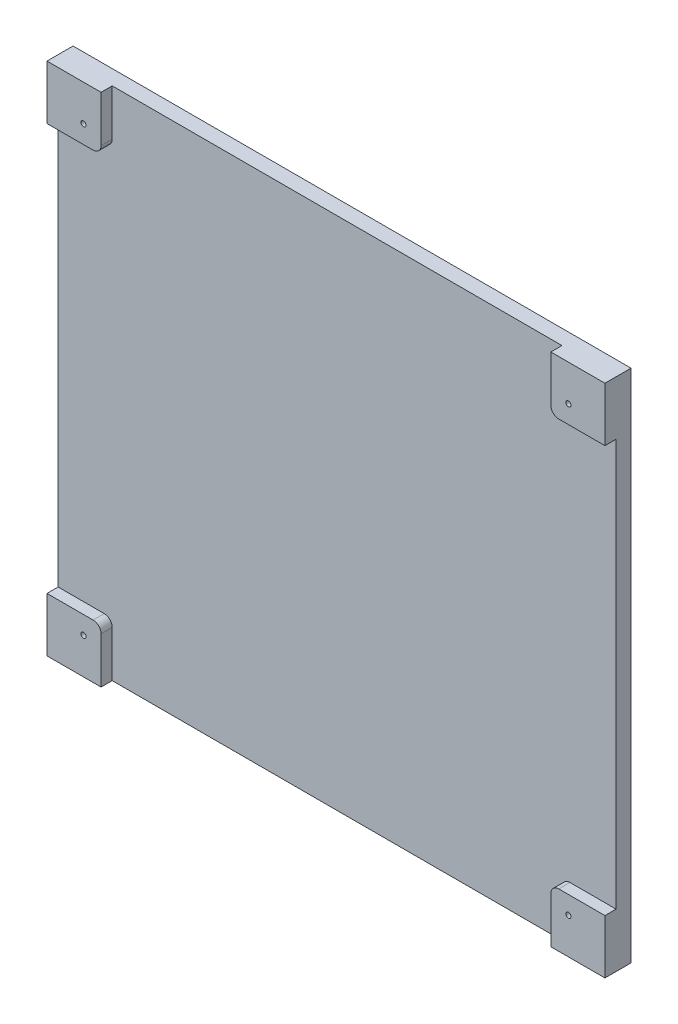
ISO-10303-21;
HEADER;
FILE_DESCRIPTION(('STEP AP214'),'2;1');
FILE_NAME('part.step','',(''),(''),'','','');
FILE_SCHEMA(('AUTOMOTIVE_DESIGN { 1 0 10303 214 1 1 1 1 }'));
ENDSEC;
DATA;
#1=APPLICATION_CONTEXT('core data for automotive mechanical design processes');
#2=APPLICATION_PROTOCOL_DEFINITION('international standard','automotive_design',2000,#1);
#3=PRODUCT_CONTEXT('',#1,'mechanical');
#4=PRODUCT('Part','Part','',(#3));
#5=PRODUCT_RELATED_PRODUCT_CATEGORY('part','',(#4));
#6=PRODUCT_DEFINITION_FORMATION('','',#4);
#7=PRODUCT_DEFINITION_CONTEXT('part definition',#1,'design');
#8=PRODUCT_DEFINITION('design','',#6,#7);
#9=PRODUCT_DEFINITION_SHAPE('','',#8);
#10=(LENGTH_UNIT() NAMED_UNIT(*) SI_UNIT(.MILLI.,.METRE.));
#11=(NAMED_UNIT(*) PLANE_ANGLE_UNIT() SI_UNIT($,.RADIAN.));
#12=(NAMED_UNIT(*) SI_UNIT($,.STERADIAN.) SOLID_ANGLE_UNIT());
#13=UNCERTAINTY_MEASURE_WITH_UNIT(LENGTH_MEASURE(1.E-05),#10,'distance_accuracy_value','');
#14=(GEOMETRIC_REPRESENTATION_CONTEXT(3) GLOBAL_UNCERTAINTY_ASSIGNED_CONTEXT((#13)) GLOBAL_UNIT_ASSIGNED_CONTEXT((#10,
#11,#12)) REPRESENTATION_CONTEXT('',''));
#15=CARTESIAN_POINT('',(0.,0.,0.));
#16=DIRECTION('',(0.,0.,1.));
#17=DIRECTION('',(1.,0.,0.));
#18=AXIS2_PLACEMENT_3D('',#15,#16,#17);
#19=CARTESIAN_POINT('',(0.,0.,0.));
#20=DIRECTION('',(0.,0.,1.));
#21=DIRECTION('',(1.,0.,0.));
#22=AXIS2_PLACEMENT_3D('',#19,#20,#21);
#23=PLANE('',#22);
#24=CARTESIAN_POINT('',(-76.2,-69.596,0.));
#25=DIRECTION('',(0.,0.,1.));
#26=DIRECTION('',(1.,0.,0.));
#27=AXIS2_PLACEMENT_3D('',#24,#25,#26);
#28=CIRCLE('',#27,1.10000000000002);
#29=CARTESIAN_POINT('',(-75.1,-69.596,0.));
#30=VERTEX_POINT('',#29);
#31=EDGE_CURVE('E380',#30,#30,#28,.T.);
#32=ORIENTED_EDGE('',*,*,#31,.T.);
#33=EDGE_LOOP('',(#32));
#34=FACE_BOUND('',#33,.T.);
#35=CARTESIAN_POINT('',(76.2,69.596,0.));
#36=DIRECTION('',(0.,0.,1.));
#37=DIRECTION('',(1.,0.,0.));
#38=AXIS2_PLACEMENT_3D('',#35,#36,#37);
#39=CIRCLE('',#38,1.10000000000002);
#40=CARTESIAN_POINT('',(77.3,69.596,0.));
#41=VERTEX_POINT('',#40);
#42=EDGE_CURVE('E372',#41,#41,#39,.T.);
#43=ORIENTED_EDGE('',*,*,#42,.T.);
#44=EDGE_LOOP('',(#43));
#45=FACE_BOUND('',#44,.T.);
#46=DIRECTION('',(-1.,0.,0.));
#47=VECTOR('',#46,1.);
#48=CARTESIAN_POINT('',(0.,-80.646,0.));
#49=LINE('',#48,#47);
#50=CARTESIAN_POINT('',(87.3769999999999,-80.646,0.));
#51=VERTEX_POINT('',#50);
#52=CARTESIAN_POINT('',(-87.377,-80.646,0.));
#53=VERTEX_POINT('',#52);
#54=EDGE_CURVE('E369',#51,#53,#49,.T.);
#55=ORIENTED_EDGE('',*,*,#54,.T.);
#56=DIRECTION('',(0.,1.,0.));
#57=VECTOR('',#56,1.);
#58=CARTESIAN_POINT('',(-87.377,0.,0.));
#59=LINE('',#58,#57);
#60=CARTESIAN_POINT('',(-87.377,80.646,0.));
#61=VERTEX_POINT('',#60);
#62=EDGE_CURVE('E371',#53,#61,#59,.T.);
#63=ORIENTED_EDGE('',*,*,#62,.T.);
#64=DIRECTION('',(1.,0.,0.));
#65=VECTOR('',#64,1.);
#66=CARTESIAN_POINT('',(0.,80.646,0.));
#67=LINE('',#66,#65);
#68=CARTESIAN_POINT('',(87.3769999999999,80.646,0.));
#69=VERTEX_POINT('',#68);
#70=EDGE_CURVE('E364',#61,#69,#67,.T.);
#71=ORIENTED_EDGE('',*,*,#70,.T.);
#72=DIRECTION('',(0.,-1.,0.));
#73=VECTOR('',#72,1.);
#74=CARTESIAN_POINT('',(87.3769999999999,0.,0.));
#75=LINE('',#74,#73);
#76=EDGE_CURVE('E370',#69,#51,#75,.T.);
#77=ORIENTED_EDGE('',*,*,#76,.T.);
#78=EDGE_LOOP('',(#55,#63,#71,#77));
#79=FACE_BOUND('',#78,.T.);
#80=CARTESIAN_POINT('',(-76.2,69.596,0.));
#81=DIRECTION('',(0.,0.,1.));
#82=DIRECTION('',(1.,0.,0.));
#83=AXIS2_PLACEMENT_3D('',#80,#81,#82);
#84=CIRCLE('',#83,1.10000000000002);
#85=CARTESIAN_POINT('',(-77.3,69.596,0.));
#86=VERTEX_POINT('',#85);
#87=EDGE_CURVE('E362',#86,#86,#84,.T.);
#88=ORIENTED_EDGE('',*,*,#87,.T.);
#89=EDGE_LOOP('',(#88));
#90=FACE_BOUND('',#89,.T.);
#91=CARTESIAN_POINT('',(76.2,-69.596,0.));
#92=DIRECTION('',(0.,0.,1.));
#93=DIRECTION('',(1.,0.,0.));
#94=AXIS2_PLACEMENT_3D('',#91,#92,#93);
#95=CIRCLE('',#94,1.09999999999996);
#96=CARTESIAN_POINT('',(77.3,-69.596,0.));
#97=VERTEX_POINT('',#96);
#98=EDGE_CURVE('E359',#97,#97,#95,.T.);
#99=ORIENTED_EDGE('',*,*,#98,.T.);
#100=EDGE_LOOP('',(#99));
#101=FACE_BOUND('',#100,.T.);
#102=ADVANCED_FACE('F43',(#34,#45,#79,#90,#101),#23,.F.);
#103=CARTESIAN_POINT('',(0.,0.,5.));
#104=DIRECTION('',(0.,0.,1.));
#105=DIRECTION('',(1.,0.,0.));
#106=AXIS2_PLACEMENT_3D('',#103,#104,#105);
#107=PLANE('',#106);
#108=DIRECTION('',(-1.,0.,0.));
#109=VECTOR('',#108,1.);
#110=CARTESIAN_POINT('',(-87.677,80.946,5.));
#111=LINE('',#110,#109);
#112=CARTESIAN_POINT('',(70.6769999999998,80.946,5.));
#113=VERTEX_POINT('',#112);
#114=CARTESIAN_POINT('',(-70.677,80.946,5.));
#115=VERTEX_POINT('',#114);
#116=EDGE_CURVE('E308',#113,#115,#111,.T.);
#117=ORIENTED_EDGE('',*,*,#116,.T.);
#118=DIRECTION('',(0.,-1.,0.));
#119=VECTOR('',#118,1.);
#120=CARTESIAN_POINT('',(-70.677,0.,5.));
#121=LINE('',#120,#119);
#122=CARTESIAN_POINT('',(-70.677,66.446,5.));
#123=VERTEX_POINT('',#122);
#124=EDGE_CURVE('E273',#115,#123,#121,.T.);
#125=ORIENTED_EDGE('',*,*,#124,.T.);
#126=CARTESIAN_POINT('',(-73.177,66.446,5.));
#127=DIRECTION('',(0.,0.,1.));
#128=DIRECTION('',(1.,0.,0.));
#129=AXIS2_PLACEMENT_3D('',#126,#127,#128);
#130=CIRCLE('',#129,2.5);
#131=CARTESIAN_POINT('',(-73.177,63.946,5.));
#132=VERTEX_POINT('',#131);
#133=EDGE_CURVE('E354',#123,#132,#130,.F.);
#134=ORIENTED_EDGE('',*,*,#133,.T.);
#135=DIRECTION('',(1.,0.,0.));
#136=VECTOR('',#135,1.);
#137=CARTESIAN_POINT('',(0.,63.946,5.));
#138=LINE('',#137,#136);
#139=CARTESIAN_POINT('',(-87.677,63.946,5.));
#140=VERTEX_POINT('',#139);
#141=EDGE_CURVE('E264',#140,#132,#138,.T.);
#142=ORIENTED_EDGE('',*,*,#141,.F.);
#143=DIRECTION('',(0.,-1.,0.));
#144=VECTOR('',#143,1.);
#145=CARTESIAN_POINT('',(-87.677,-80.946,5.));
#146=LINE('',#145,#144);
#147=CARTESIAN_POINT('',(-87.677,-63.946,5.));
#148=VERTEX_POINT('',#147);
#149=EDGE_CURVE('E306',#140,#148,#146,.T.);
#150=ORIENTED_EDGE('',*,*,#149,.T.);
#151=DIRECTION('',(1.,0.,0.));
#152=VECTOR('',#151,1.);
#153=CARTESIAN_POINT('',(0.,-63.946,5.));
#154=LINE('',#153,#152);
#155=CARTESIAN_POINT('',(-73.1769999999999,-63.946,5.));
#156=VERTEX_POINT('',#155);
#157=EDGE_CURVE('E290',#148,#156,#154,.T.);
#158=ORIENTED_EDGE('',*,*,#157,.T.);
#159=CARTESIAN_POINT('',(-73.1769999999999,-66.446,5.));
#160=DIRECTION('',(0.,0.,1.));
#161=DIRECTION('',(1.,0.,0.));
#162=AXIS2_PLACEMENT_3D('',#159,#160,#161);
#163=CIRCLE('',#162,2.5);
#164=CARTESIAN_POINT('',(-70.6769999999999,-66.446,5.));
#165=VERTEX_POINT('',#164);
#166=EDGE_CURVE('E346',#156,#165,#163,.F.);
#167=ORIENTED_EDGE('',*,*,#166,.T.);
#168=DIRECTION('',(0.,1.,0.));
#169=VECTOR('',#168,1.);
#170=CARTESIAN_POINT('',(-70.6769999999999,0.,5.));
#171=LINE('',#170,#169);
#172=CARTESIAN_POINT('',(-70.677,-80.946,5.));
#173=VERTEX_POINT('',#172);
#174=EDGE_CURVE('E210',#173,#165,#171,.T.);
#175=ORIENTED_EDGE('',*,*,#174,.F.);
#176=DIRECTION('',(1.,0.,0.));
#177=VECTOR('',#176,1.);
#178=CARTESIAN_POINT('',(-87.677,-80.946,5.));
#179=LINE('',#178,#177);
#180=CARTESIAN_POINT('',(70.6769999999999,-80.946,5.));
#181=VERTEX_POINT('',#180);
#182=EDGE_CURVE('E309',#173,#181,#179,.T.);
#183=ORIENTED_EDGE('',*,*,#182,.T.);
#184=DIRECTION('',(0.,1.,0.));
#185=VECTOR('',#184,1.);
#186=CARTESIAN_POINT('',(70.6769999999999,0.,5.));
#187=LINE('',#186,#185);
#188=CARTESIAN_POINT('',(70.6769999999999,-66.446,5.));
#189=VERTEX_POINT('',#188);
#190=EDGE_CURVE('E202',#181,#189,#187,.T.);
#191=ORIENTED_EDGE('',*,*,#190,.T.);
#192=CARTESIAN_POINT('',(73.1769999999999,-66.446,5.));
#193=DIRECTION('',(0.,0.,1.));
#194=DIRECTION('',(1.,0.,0.));
#195=AXIS2_PLACEMENT_3D('',#192,#193,#194);
#196=CIRCLE('',#195,2.5);
#197=CARTESIAN_POINT('',(73.1769999999999,-63.946,5.));
#198=VERTEX_POINT('',#197);
#199=EDGE_CURVE('E348',#189,#198,#196,.F.);
#200=ORIENTED_EDGE('',*,*,#199,.T.);
#201=DIRECTION('',(-1.,0.,0.));
#202=VECTOR('',#201,1.);
#203=CARTESIAN_POINT('',(0.,-63.946,5.));
#204=LINE('',#203,#202);
#205=CARTESIAN_POINT('',(87.6769999999999,-63.946,5.));
#206=VERTEX_POINT('',#205);
#207=EDGE_CURVE('E225',#206,#198,#204,.T.);
#208=ORIENTED_EDGE('',*,*,#207,.F.);
#209=DIRECTION('',(0.,1.,0.));
#210=VECTOR('',#209,1.);
#211=CARTESIAN_POINT('',(87.6769999999999,-80.946,5.));
#212=LINE('',#211,#210);
#213=CARTESIAN_POINT('',(87.6769999999999,63.946,5.));
#214=VERTEX_POINT('',#213);
#215=EDGE_CURVE('E315',#206,#214,#212,.T.);
#216=ORIENTED_EDGE('',*,*,#215,.T.);
#217=DIRECTION('',(-1.,0.,0.));
#218=VECTOR('',#217,1.);
#219=CARTESIAN_POINT('',(0.,63.946,5.));
#220=LINE('',#219,#218);
#221=CARTESIAN_POINT('',(73.1769999999999,63.946,5.));
#222=VERTEX_POINT('',#221);
#223=EDGE_CURVE('E243',#214,#222,#220,.T.);
#224=ORIENTED_EDGE('',*,*,#223,.T.);
#225=CARTESIAN_POINT('',(73.1769999999999,66.446,5.));
#226=DIRECTION('',(0.,0.,1.));
#227=DIRECTION('',(1.,0.,0.));
#228=AXIS2_PLACEMENT_3D('',#225,#226,#227);
#229=CIRCLE('',#228,2.5);
#230=CARTESIAN_POINT('',(70.6769999999999,66.446,5.));
#231=VERTEX_POINT('',#230);
#232=EDGE_CURVE('E355',#222,#231,#229,.F.);
#233=ORIENTED_EDGE('',*,*,#232,.T.);
#234=DIRECTION('',(0.,-1.,0.));
#235=VECTOR('',#234,1.);
#236=CARTESIAN_POINT('',(70.6769999999999,0.,5.));
#237=LINE('',#236,#235);
#238=EDGE_CURVE('E253',#113,#231,#237,.T.);
#239=ORIENTED_EDGE('',*,*,#238,.F.);
#240=EDGE_LOOP('',(#117,#125,#134,#142,#150,#158,#167,#175,#183,#191,#200,#208,#216,#224,#233,#239));
#241=FACE_BOUND('',#240,.T.);
#242=ADVANCED_FACE('F442',(#241),#107,.T.);
#243=CARTESIAN_POINT('',(-87.677,80.946,5.));
#244=DIRECTION('',(0.,-1.,0.));
#245=DIRECTION('',(0.,0.,-1.));
#246=AXIS2_PLACEMENT_3D('',#243,#244,#245);
#247=PLANE('',#246);
#248=DIRECTION('',(0.,0.,-1.));
#249=VECTOR('',#248,1.);
#250=CARTESIAN_POINT('',(87.6769999999999,80.946,5.));
#251=LINE('',#250,#249);
#252=CARTESIAN_POINT('',(87.6769999999999,80.946,8.5));
#253=VERTEX_POINT('',#252);
#254=CARTESIAN_POINT('',(87.6769999999999,80.946,0.299999999999995));
#255=VERTEX_POINT('',#254);
#256=EDGE_CURVE('E314',#253,#255,#251,.T.);
#257=ORIENTED_EDGE('',*,*,#256,.T.);
#258=DIRECTION('',(-1.,0.,0.));
#259=VECTOR('',#258,1.);
#260=CARTESIAN_POINT('',(-87.677,80.946,0.299999999999995));
#261=LINE('',#260,#259);
#262=CARTESIAN_POINT('',(-87.677,80.946,0.299999999999995));
#263=VERTEX_POINT('',#262);
#264=EDGE_CURVE('E389',#255,#263,#261,.T.);
#265=ORIENTED_EDGE('',*,*,#264,.T.);
#266=DIRECTION('',(0.,0.,-1.));
#267=VECTOR('',#266,1.);
#268=CARTESIAN_POINT('',(-87.677,80.946,5.));
#269=LINE('',#268,#267);
#270=CARTESIAN_POINT('',(-87.677,80.946,8.5));
#271=VERTEX_POINT('',#270);
#272=EDGE_CURVE('E317',#271,#263,#269,.T.);
#273=ORIENTED_EDGE('',*,*,#272,.F.);
#274=DIRECTION('',(-1.,0.,0.));
#275=VECTOR('',#274,1.);
#276=CARTESIAN_POINT('',(0.,80.946,8.5));
#277=LINE('',#276,#275);
#278=CARTESIAN_POINT('',(-70.677,80.946,8.5));
#279=VERTEX_POINT('',#278);
#280=EDGE_CURVE('E262',#279,#271,#277,.T.);
#281=ORIENTED_EDGE('',*,*,#280,.F.);
#282=DIRECTION('',(0.,0.,-1.));
#283=VECTOR('',#282,1.);
#284=CARTESIAN_POINT('',(-70.677,80.946,8.5));
#285=LINE('',#284,#283);
#286=EDGE_CURVE('E255',#279,#115,#285,.T.);
#287=ORIENTED_EDGE('',*,*,#286,.T.);
#288=ORIENTED_EDGE('',*,*,#116,.F.);
#289=DIRECTION('',(0.,0.,-1.));
#290=VECTOR('',#289,1.);
#291=CARTESIAN_POINT('',(70.6769999999999,80.946,8.5));
#292=LINE('',#291,#290);
#293=CARTESIAN_POINT('',(70.6769999999999,80.946,8.5));
#294=VERTEX_POINT('',#293);
#295=EDGE_CURVE('E233',#294,#113,#292,.T.);
#296=ORIENTED_EDGE('',*,*,#295,.F.);
#297=DIRECTION('',(-1.,0.,0.));
#298=VECTOR('',#297,1.);
#299=CARTESIAN_POINT('',(0.,80.946,8.5));
#300=LINE('',#299,#298);
#301=EDGE_CURVE('E240',#253,#294,#300,.T.);
#302=ORIENTED_EDGE('',*,*,#301,.F.);
#303=EDGE_LOOP('',(#257,#265,#273,#281,#287,#288,#296,#302));
#304=FACE_BOUND('',#303,.T.);
#305=ADVANCED_FACE('F448',(#304),#247,.F.);
#306=CARTESIAN_POINT('',(-87.677,-80.946,5.));
#307=DIRECTION('',(1.,0.,0.));
#308=DIRECTION('',(0.,0.,-1.));
#309=AXIS2_PLACEMENT_3D('',#306,#307,#308);
#310=PLANE('',#309);
#311=ORIENTED_EDGE('',*,*,#272,.T.);
#312=DIRECTION('',(0.,-1.,0.));
#313=VECTOR('',#312,1.);
#314=CARTESIAN_POINT('',(-87.677,-80.946,0.299999999999995));
#315=LINE('',#314,#313);
#316=CARTESIAN_POINT('',(-87.677,-80.946,0.299999999999995));
#317=VERTEX_POINT('',#316);
#318=EDGE_CURVE('E382',#263,#317,#315,.T.);
#319=ORIENTED_EDGE('',*,*,#318,.T.);
#320=DIRECTION('',(0.,0.,-1.));
#321=VECTOR('',#320,1.);
#322=CARTESIAN_POINT('',(-87.677,-80.946,5.));
#323=LINE('',#322,#321);
#324=CARTESIAN_POINT('',(-87.677,-80.946,8.5));
#325=VERTEX_POINT('',#324);
#326=EDGE_CURVE('E320',#325,#317,#323,.T.);
#327=ORIENTED_EDGE('',*,*,#326,.F.);
#328=DIRECTION('',(0.,-1.,0.));
#329=VECTOR('',#328,1.);
#330=CARTESIAN_POINT('',(-87.677,0.,8.5));
#331=LINE('',#330,#329);
#332=CARTESIAN_POINT('',(-87.677,-63.946,8.5));
#333=VERTEX_POINT('',#332);
#334=EDGE_CURVE('E291',#333,#325,#331,.T.);
#335=ORIENTED_EDGE('',*,*,#334,.F.);
#336=DIRECTION('',(0.,0.,-1.));
#337=VECTOR('',#336,1.);
#338=CARTESIAN_POINT('',(-87.677,-63.946,8.5));
#339=LINE('',#338,#337);
#340=EDGE_CURVE('E298',#333,#148,#339,.T.);
#341=ORIENTED_EDGE('',*,*,#340,.T.);
#342=ORIENTED_EDGE('',*,*,#149,.F.);
#343=DIRECTION('',(0.,0.,-1.));
#344=VECTOR('',#343,1.);
#345=CARTESIAN_POINT('',(-87.677,63.946,8.5));
#346=LINE('',#345,#344);
#347=CARTESIAN_POINT('',(-87.677,63.946,8.5));
#348=VERTEX_POINT('',#347);
#349=EDGE_CURVE('E272',#348,#140,#346,.T.);
#350=ORIENTED_EDGE('',*,*,#349,.F.);
#351=DIRECTION('',(0.,-1.,0.));
#352=VECTOR('',#351,1.);
#353=CARTESIAN_POINT('',(-87.677,0.,8.5));
#354=LINE('',#353,#352);
#355=EDGE_CURVE('E268',#271,#348,#354,.T.);
#356=ORIENTED_EDGE('',*,*,#355,.F.);
#357=EDGE_LOOP('',(#311,#319,#327,#335,#341,#342,#350,#356));
#358=FACE_BOUND('',#357,.T.);
#359=ADVANCED_FACE('F446',(#358),#310,.F.);
#360=CARTESIAN_POINT('',(-87.677,-80.946,5.));
#361=DIRECTION('',(0.,1.,0.));
#362=DIRECTION('',(0.,0.,1.));
#363=AXIS2_PLACEMENT_3D('',#360,#361,#362);
#364=PLANE('',#363);
#365=ORIENTED_EDGE('',*,*,#326,.T.);
#366=DIRECTION('',(1.,0.,0.));
#367=VECTOR('',#366,1.);
#368=CARTESIAN_POINT('',(-87.677,-80.946,0.299999999999995));
#369=LINE('',#368,#367);
#370=CARTESIAN_POINT('',(87.6769999999999,-80.946,0.299999999999995));
#371=VERTEX_POINT('',#370);
#372=EDGE_CURVE('E69',#317,#371,#369,.T.);
#373=ORIENTED_EDGE('',*,*,#372,.T.);
#374=DIRECTION('',(0.,0.,-1.));
#375=VECTOR('',#374,1.);
#376=CARTESIAN_POINT('',(87.6769999999999,-80.946,5.));
#377=LINE('',#376,#375);
#378=CARTESIAN_POINT('',(87.6769999999999,-80.946,8.5));
#379=VERTEX_POINT('',#378);
#380=EDGE_CURVE('E213',#379,#371,#377,.T.);
#381=ORIENTED_EDGE('',*,*,#380,.F.);
#382=DIRECTION('',(1.,0.,0.));
#383=VECTOR('',#382,1.);
#384=CARTESIAN_POINT('',(0.,-80.946,8.5));
#385=LINE('',#384,#383);
#386=CARTESIAN_POINT('',(70.6769999999999,-80.946,8.5));
#387=VERTEX_POINT('',#386);
#388=EDGE_CURVE('E211',#387,#379,#385,.T.);
#389=ORIENTED_EDGE('',*,*,#388,.F.);
#390=DIRECTION('',(0.,0.,-1.));
#391=VECTOR('',#390,1.);
#392=CARTESIAN_POINT('',(70.6769999999999,-80.946,8.5));
#393=LINE('',#392,#391);
#394=EDGE_CURVE('E197',#387,#181,#393,.T.);
#395=ORIENTED_EDGE('',*,*,#394,.T.);
#396=ORIENTED_EDGE('',*,*,#182,.F.);
#397=DIRECTION('',(0.,0.,-1.));
#398=VECTOR('',#397,1.);
#399=CARTESIAN_POINT('',(-70.6769999999999,-80.946,8.5));
#400=LINE('',#399,#398);
#401=CARTESIAN_POINT('',(-70.6769999999999,-80.946,8.5));
#402=VERTEX_POINT('',#401);
#403=EDGE_CURVE('E303',#402,#173,#400,.T.);
#404=ORIENTED_EDGE('',*,*,#403,.F.);
#405=DIRECTION('',(1.,0.,0.));
#406=VECTOR('',#405,1.);
#407=CARTESIAN_POINT('',(0.,-80.946,8.5));
#408=LINE('',#407,#406);
#409=EDGE_CURVE('E281',#325,#402,#408,.T.);
#410=ORIENTED_EDGE('',*,*,#409,.F.);
#411=EDGE_LOOP('',(#365,#373,#381,#389,#395,#396,#404,#410));
#412=FACE_BOUND('',#411,.T.);
#413=ADVANCED_FACE('F215',(#412),#364,.F.);
#414=CARTESIAN_POINT('',(87.6769999999999,-80.946,5.));
#415=DIRECTION('',(-1.,0.,0.));
#416=DIRECTION('',(0.,0.,1.));
#417=AXIS2_PLACEMENT_3D('',#414,#415,#416);
#418=PLANE('',#417);
#419=ORIENTED_EDGE('',*,*,#380,.T.);
#420=DIRECTION('',(0.,1.,0.));
#421=VECTOR('',#420,1.);
#422=CARTESIAN_POINT('',(87.6769999999999,-80.946,0.299999999999995));
#423=LINE('',#422,#421);
#424=EDGE_CURVE('E63',#371,#255,#423,.T.);
#425=ORIENTED_EDGE('',*,*,#424,.T.);
#426=ORIENTED_EDGE('',*,*,#256,.F.);
#427=DIRECTION('',(0.,1.,0.));
#428=VECTOR('',#427,1.);
#429=CARTESIAN_POINT('',(87.6769999999999,0.,8.5));
#430=LINE('',#429,#428);
#431=CARTESIAN_POINT('',(87.6769999999999,63.946,8.5));
#432=VERTEX_POINT('',#431);
#433=EDGE_CURVE('E250',#432,#253,#430,.T.);
#434=ORIENTED_EDGE('',*,*,#433,.F.);
#435=DIRECTION('',(0.,0.,-1.));
#436=VECTOR('',#435,1.);
#437=CARTESIAN_POINT('',(87.6769999999999,63.946,8.5));
#438=LINE('',#437,#436);
#439=EDGE_CURVE('E246',#432,#214,#438,.T.);
#440=ORIENTED_EDGE('',*,*,#439,.T.);
#441=ORIENTED_EDGE('',*,*,#215,.F.);
#442=DIRECTION('',(0.,0.,-1.));
#443=VECTOR('',#442,1.);
#444=CARTESIAN_POINT('',(87.6769999999999,-63.946,8.5));
#445=LINE('',#444,#443);
#446=CARTESIAN_POINT('',(87.6769999999999,-63.946,8.5));
#447=VERTEX_POINT('',#446);
#448=EDGE_CURVE('E208',#447,#206,#445,.T.);
#449=ORIENTED_EDGE('',*,*,#448,.F.);
#450=DIRECTION('',(0.,1.,0.));
#451=VECTOR('',#450,1.);
#452=CARTESIAN_POINT('',(87.6769999999999,0.,8.5));
#453=LINE('',#452,#451);
#454=EDGE_CURVE('E216',#379,#447,#453,.T.);
#455=ORIENTED_EDGE('',*,*,#454,.F.);
#456=EDGE_LOOP('',(#419,#425,#426,#434,#440,#441,#449,#455));
#457=FACE_BOUND('',#456,.T.);
#458=ADVANCED_FACE('F497',(#457),#418,.F.);
#459=CARTESIAN_POINT('',(-70.6769999999999,0.,8.5));
#460=DIRECTION('',(-1.,0.,0.));
#461=DIRECTION('',(0.,0.,1.));
#462=AXIS2_PLACEMENT_3D('',#459,#460,#461);
#463=PLANE('',#462);
#464=ORIENTED_EDGE('',*,*,#174,.T.);
#465=DIRECTION('',(0.,0.,-1.));
#466=VECTOR('',#465,1.);
#467=CARTESIAN_POINT('',(-70.6769999999999,-66.446,8.5));
#468=LINE('',#467,#466);
#469=CARTESIAN_POINT('',(-70.6769999999999,-66.446,8.5));
#470=VERTEX_POINT('',#469);
#471=EDGE_CURVE('E324',#165,#470,#468,.F.);
#472=ORIENTED_EDGE('',*,*,#471,.T.);
#473=DIRECTION('',(0.,1.,0.));
#474=VECTOR('',#473,1.);
#475=CARTESIAN_POINT('',(-70.6769999999999,0.,8.5));
#476=LINE('',#475,#474);
#477=EDGE_CURVE('E287',#402,#470,#476,.T.);
#478=ORIENTED_EDGE('',*,*,#477,.F.);
#479=ORIENTED_EDGE('',*,*,#403,.T.);
#480=EDGE_LOOP('',(#464,#472,#478,#479));
#481=FACE_BOUND('',#480,.T.);
#482=ADVANCED_FACE('F465',(#481),#463,.F.);
#483=CARTESIAN_POINT('',(0.,-63.946,8.5));
#484=DIRECTION('',(0.,1.,0.));
#485=DIRECTION('',(0.,0.,1.));
#486=AXIS2_PLACEMENT_3D('',#483,#484,#485);
#487=PLANE('',#486);
#488=DIRECTION('',(1.,0.,0.));
#489=VECTOR('',#488,1.);
#490=CARTESIAN_POINT('',(0.,-63.946,8.5));
#491=LINE('',#490,#489);
#492=CARTESIAN_POINT('',(-73.1769999999999,-63.946,8.5));
#493=VERTEX_POINT('',#492);
#494=EDGE_CURVE('E286',#333,#493,#491,.T.);
#495=ORIENTED_EDGE('',*,*,#494,.T.);
#496=DIRECTION('',(0.,0.,-1.));
#497=VECTOR('',#496,1.);
#498=CARTESIAN_POINT('',(-73.1769999999999,-63.946,5.));
#499=LINE('',#498,#497);
#500=EDGE_CURVE('E325',#493,#156,#499,.T.);
#501=ORIENTED_EDGE('',*,*,#500,.T.);
#502=ORIENTED_EDGE('',*,*,#157,.F.);
#503=ORIENTED_EDGE('',*,*,#340,.F.);
#504=EDGE_LOOP('',(#495,#501,#502,#503));
#505=FACE_BOUND('',#504,.T.);
#506=ADVANCED_FACE('F451',(#505),#487,.T.);
#507=CARTESIAN_POINT('',(0.,0.,8.5));
#508=DIRECTION('',(0.,0.,1.));
#509=DIRECTION('',(1.,0.,0.));
#510=AXIS2_PLACEMENT_3D('',#507,#508,#509);
#511=PLANE('',#510);
#512=CARTESIAN_POINT('',(-76.2,-69.596,8.5));
#513=DIRECTION('',(0.,0.,1.));
#514=DIRECTION('',(1.,0.,0.));
#515=AXIS2_PLACEMENT_3D('',#512,#513,#514);
#516=CIRCLE('',#515,0.799999999999994);
#517=CARTESIAN_POINT('',(-75.4,-69.596,8.5));
#518=VERTEX_POINT('',#517);
#519=EDGE_CURVE('E402',#518,#518,#516,.F.);
#520=ORIENTED_EDGE('',*,*,#519,.T.);
#521=EDGE_LOOP('',(#520));
#522=FACE_BOUND('',#521,.T.);
#523=ORIENTED_EDGE('',*,*,#477,.T.);
#524=CARTESIAN_POINT('',(-73.1769999999999,-66.446,8.5));
#525=DIRECTION('',(0.,0.,1.));
#526=DIRECTION('',(1.,0.,0.));
#527=AXIS2_PLACEMENT_3D('',#524,#525,#526);
#528=CIRCLE('',#527,2.5);
#529=EDGE_CURVE('E330',#470,#493,#528,.T.);
#530=ORIENTED_EDGE('',*,*,#529,.T.);
#531=ORIENTED_EDGE('',*,*,#494,.F.);
#532=ORIENTED_EDGE('',*,*,#334,.T.);
#533=ORIENTED_EDGE('',*,*,#409,.T.);
#534=EDGE_LOOP('',(#523,#530,#531,#532,#533));
#535=FACE_BOUND('',#534,.T.);
#536=ADVANCED_FACE('F729',(#522,#535),#511,.T.);
#537=CARTESIAN_POINT('',(70.6769999999999,0.,8.5));
#538=DIRECTION('',(-1.,0.,0.));
#539=DIRECTION('',(0.,0.,1.));
#540=AXIS2_PLACEMENT_3D('',#537,#538,#539);
#541=PLANE('',#540);
#542=DIRECTION('',(0.,1.,0.));
#543=VECTOR('',#542,1.);
#544=CARTESIAN_POINT('',(70.6769999999999,0.,8.5));
#545=LINE('',#544,#543);
#546=CARTESIAN_POINT('',(70.6769999999999,-66.446,8.5));
#547=VERTEX_POINT('',#546);
#548=EDGE_CURVE('E205',#387,#547,#545,.T.);
#549=ORIENTED_EDGE('',*,*,#548,.T.);
#550=DIRECTION('',(0.,0.,-1.));
#551=VECTOR('',#550,1.);
#552=CARTESIAN_POINT('',(70.6769999999999,-66.446,5.));
#553=LINE('',#552,#551);
#554=EDGE_CURVE('E328',#547,#189,#553,.T.);
#555=ORIENTED_EDGE('',*,*,#554,.T.);
#556=ORIENTED_EDGE('',*,*,#190,.F.);
#557=ORIENTED_EDGE('',*,*,#394,.F.);
#558=EDGE_LOOP('',(#549,#555,#556,#557));
#559=FACE_BOUND('',#558,.T.);
#560=ADVANCED_FACE('F200',(#559),#541,.T.);
#561=CARTESIAN_POINT('',(0.,-63.946,8.5));
#562=DIRECTION('',(0.,-1.,0.));
#563=DIRECTION('',(0.,0.,-1.));
#564=AXIS2_PLACEMENT_3D('',#561,#562,#563);
#565=PLANE('',#564);
#566=ORIENTED_EDGE('',*,*,#207,.T.);
#567=DIRECTION('',(0.,0.,-1.));
#568=VECTOR('',#567,1.);
#569=CARTESIAN_POINT('',(73.1769999999999,-63.946,8.5));
#570=LINE('',#569,#568);
#571=CARTESIAN_POINT('',(73.1769999999999,-63.946,8.5));
#572=VERTEX_POINT('',#571);
#573=EDGE_CURVE('E332',#198,#572,#570,.F.);
#574=ORIENTED_EDGE('',*,*,#573,.T.);
#575=DIRECTION('',(-1.,0.,0.));
#576=VECTOR('',#575,1.);
#577=CARTESIAN_POINT('',(0.,-63.946,8.5));
#578=LINE('',#577,#576);
#579=EDGE_CURVE('E232',#447,#572,#578,.T.);
#580=ORIENTED_EDGE('',*,*,#579,.F.);
#581=ORIENTED_EDGE('',*,*,#448,.T.);
#582=EDGE_LOOP('',(#566,#574,#580,#581));
#583=FACE_BOUND('',#582,.T.);
#584=ADVANCED_FACE('F469',(#583),#565,.F.);
#585=CARTESIAN_POINT('',(0.,0.,8.5));
#586=DIRECTION('',(0.,0.,1.));
#587=DIRECTION('',(1.,0.,0.));
#588=AXIS2_PLACEMENT_3D('',#585,#586,#587);
#589=PLANE('',#588);
#590=CARTESIAN_POINT('',(76.2,-69.596,8.5));
#591=DIRECTION('',(0.,0.,1.));
#592=DIRECTION('',(1.,0.,0.));
#593=AXIS2_PLACEMENT_3D('',#590,#591,#592);
#594=CIRCLE('',#593,0.799999999999994);
#595=CARTESIAN_POINT('',(77.,-69.596,8.5));
#596=VERTEX_POINT('',#595);
#597=EDGE_CURVE('E410',#596,#596,#594,.T.);
#598=ORIENTED_EDGE('',*,*,#597,.F.);
#599=EDGE_LOOP('',(#598));
#600=FACE_BOUND('',#599,.T.);
#601=ORIENTED_EDGE('',*,*,#579,.T.);
#602=CARTESIAN_POINT('',(73.1769999999999,-66.446,8.5));
#603=DIRECTION('',(0.,0.,1.));
#604=DIRECTION('',(1.,0.,0.));
#605=AXIS2_PLACEMENT_3D('',#602,#603,#604);
#606=CIRCLE('',#605,2.5);
#607=EDGE_CURVE('E222',#572,#547,#606,.T.);
#608=ORIENTED_EDGE('',*,*,#607,.T.);
#609=ORIENTED_EDGE('',*,*,#548,.F.);
#610=ORIENTED_EDGE('',*,*,#388,.T.);
#611=ORIENTED_EDGE('',*,*,#454,.T.);
#612=EDGE_LOOP('',(#601,#608,#609,#610,#611));
#613=FACE_BOUND('',#612,.T.);
#614=ADVANCED_FACE('F218',(#600,#613),#589,.T.);
#615=CARTESIAN_POINT('',(70.6769999999999,0.,8.5));
#616=DIRECTION('',(1.,0.,0.));
#617=DIRECTION('',(0.,0.,-1.));
#618=AXIS2_PLACEMENT_3D('',#615,#616,#617);
#619=PLANE('',#618);
#620=ORIENTED_EDGE('',*,*,#238,.T.);
#621=DIRECTION('',(0.,0.,-1.));
#622=VECTOR('',#621,1.);
#623=CARTESIAN_POINT('',(70.6769999999999,66.446,8.5));
#624=LINE('',#623,#622);
#625=CARTESIAN_POINT('',(70.6769999999999,66.446,8.5));
#626=VERTEX_POINT('',#625);
#627=EDGE_CURVE('E340',#231,#626,#624,.F.);
#628=ORIENTED_EDGE('',*,*,#627,.T.);
#629=DIRECTION('',(0.,-1.,0.));
#630=VECTOR('',#629,1.);
#631=CARTESIAN_POINT('',(70.6769999999999,0.,8.5));
#632=LINE('',#631,#630);
#633=EDGE_CURVE('E238',#294,#626,#632,.T.);
#634=ORIENTED_EDGE('',*,*,#633,.F.);
#635=ORIENTED_EDGE('',*,*,#295,.T.);
#636=EDGE_LOOP('',(#620,#628,#634,#635));
#637=FACE_BOUND('',#636,.T.);
#638=ADVANCED_FACE('F700',(#637),#619,.F.);
#639=CARTESIAN_POINT('',(0.,63.946,8.5));
#640=DIRECTION('',(0.,-1.,0.));
#641=DIRECTION('',(0.,0.,-1.));
#642=AXIS2_PLACEMENT_3D('',#639,#640,#641);
#643=PLANE('',#642);
#644=DIRECTION('',(-1.,0.,0.));
#645=VECTOR('',#644,1.);
#646=CARTESIAN_POINT('',(0.,63.946,8.5));
#647=LINE('',#646,#645);
#648=CARTESIAN_POINT('',(73.1769999999999,63.946,8.5));
#649=VERTEX_POINT('',#648);
#650=EDGE_CURVE('E244',#432,#649,#647,.T.);
#651=ORIENTED_EDGE('',*,*,#650,.T.);
#652=DIRECTION('',(0.,0.,-1.));
#653=VECTOR('',#652,1.);
#654=CARTESIAN_POINT('',(73.1769999999999,63.946,5.));
#655=LINE('',#654,#653);
#656=EDGE_CURVE('E331',#649,#222,#655,.T.);
#657=ORIENTED_EDGE('',*,*,#656,.T.);
#658=ORIENTED_EDGE('',*,*,#223,.F.);
#659=ORIENTED_EDGE('',*,*,#439,.F.);
#660=EDGE_LOOP('',(#651,#657,#658,#659));
#661=FACE_BOUND('',#660,.T.);
#662=ADVANCED_FACE('F689',(#661),#643,.T.);
#663=CARTESIAN_POINT('',(0.,0.,8.5));
#664=DIRECTION('',(0.,0.,1.));
#665=DIRECTION('',(1.,0.,0.));
#666=AXIS2_PLACEMENT_3D('',#663,#664,#665);
#667=PLANE('',#666);
#668=CARTESIAN_POINT('',(76.2,69.596,8.5));
#669=DIRECTION('',(0.,0.,1.));
#670=DIRECTION('',(1.,0.,0.));
#671=AXIS2_PLACEMENT_3D('',#668,#669,#670);
#672=CIRCLE('',#671,0.799999999999994);
#673=CARTESIAN_POINT('',(77.,69.596,8.5));
#674=VERTEX_POINT('',#673);
#675=EDGE_CURVE('E412',#674,#674,#672,.F.);
#676=ORIENTED_EDGE('',*,*,#675,.T.);
#677=EDGE_LOOP('',(#676));
#678=FACE_BOUND('',#677,.T.);
#679=ORIENTED_EDGE('',*,*,#633,.T.);
#680=CARTESIAN_POINT('',(73.1769999999999,66.446,8.5));
#681=DIRECTION('',(0.,0.,1.));
#682=DIRECTION('',(1.,0.,0.));
#683=AXIS2_PLACEMENT_3D('',#680,#681,#682);
#684=CIRCLE('',#683,2.5);
#685=EDGE_CURVE('E339',#626,#649,#684,.T.);
#686=ORIENTED_EDGE('',*,*,#685,.T.);
#687=ORIENTED_EDGE('',*,*,#650,.F.);
#688=ORIENTED_EDGE('',*,*,#433,.T.);
#689=ORIENTED_EDGE('',*,*,#301,.T.);
#690=EDGE_LOOP('',(#679,#686,#687,#688,#689));
#691=FACE_BOUND('',#690,.T.);
#692=ADVANCED_FACE('F683',(#678,#691),#667,.T.);
#693=CARTESIAN_POINT('',(-70.677,0.,8.5));
#694=DIRECTION('',(1.,0.,0.));
#695=DIRECTION('',(0.,0.,-1.));
#696=AXIS2_PLACEMENT_3D('',#693,#694,#695);
#697=PLANE('',#696);
#698=DIRECTION('',(0.,-1.,0.));
#699=VECTOR('',#698,1.);
#700=CARTESIAN_POINT('',(-70.677,0.,8.5));
#701=LINE('',#700,#699);
#702=CARTESIAN_POINT('',(-70.677,66.446,8.5));
#703=VERTEX_POINT('',#702);
#704=EDGE_CURVE('E261',#279,#703,#701,.T.);
#705=ORIENTED_EDGE('',*,*,#704,.T.);
#706=DIRECTION('',(0.,0.,-1.));
#707=VECTOR('',#706,1.);
#708=CARTESIAN_POINT('',(-70.677,66.446,5.));
#709=LINE('',#708,#707);
#710=EDGE_CURVE('E342',#703,#123,#709,.T.);
#711=ORIENTED_EDGE('',*,*,#710,.T.);
#712=ORIENTED_EDGE('',*,*,#124,.F.);
#713=ORIENTED_EDGE('',*,*,#286,.F.);
#714=EDGE_LOOP('',(#705,#711,#712,#713));
#715=FACE_BOUND('',#714,.T.);
#716=ADVANCED_FACE('F438',(#715),#697,.T.);
#717=CARTESIAN_POINT('',(0.,63.946,8.5));
#718=DIRECTION('',(0.,1.,0.));
#719=DIRECTION('',(0.,0.,1.));
#720=AXIS2_PLACEMENT_3D('',#717,#718,#719);
#721=PLANE('',#720);
#722=ORIENTED_EDGE('',*,*,#141,.T.);
#723=DIRECTION('',(0.,0.,-1.));
#724=VECTOR('',#723,1.);
#725=CARTESIAN_POINT('',(-73.177,63.946,8.5));
#726=LINE('',#725,#724);
#727=CARTESIAN_POINT('',(-73.177,63.946,8.5));
#728=VERTEX_POINT('',#727);
#729=EDGE_CURVE('E344',#132,#728,#726,.F.);
#730=ORIENTED_EDGE('',*,*,#729,.T.);
#731=DIRECTION('',(1.,0.,0.));
#732=VECTOR('',#731,1.);
#733=CARTESIAN_POINT('',(0.,63.946,8.5));
#734=LINE('',#733,#732);
#735=EDGE_CURVE('E269',#348,#728,#734,.T.);
#736=ORIENTED_EDGE('',*,*,#735,.F.);
#737=ORIENTED_EDGE('',*,*,#349,.T.);
#738=EDGE_LOOP('',(#722,#730,#736,#737));
#739=FACE_BOUND('',#738,.T.);
#740=ADVANCED_FACE('F422',(#739),#721,.F.);
#741=CARTESIAN_POINT('',(0.,0.,8.5));
#742=DIRECTION('',(0.,0.,1.));
#743=DIRECTION('',(1.,0.,0.));
#744=AXIS2_PLACEMENT_3D('',#741,#742,#743);
#745=PLANE('',#744);
#746=CARTESIAN_POINT('',(-76.2,69.596,8.5));
#747=DIRECTION('',(0.,0.,1.));
#748=DIRECTION('',(1.,0.,0.));
#749=AXIS2_PLACEMENT_3D('',#746,#747,#748);
#750=CIRCLE('',#749,0.799999999999994);
#751=CARTESIAN_POINT('',(-75.4,69.596,8.5));
#752=VERTEX_POINT('',#751);
#753=EDGE_CURVE('E230',#752,#752,#750,.T.);
#754=ORIENTED_EDGE('',*,*,#753,.F.);
#755=EDGE_LOOP('',(#754));
#756=FACE_BOUND('',#755,.T.);
#757=ORIENTED_EDGE('',*,*,#735,.T.);
#758=CARTESIAN_POINT('',(-73.177,66.446,8.5));
#759=DIRECTION('',(0.,0.,1.));
#760=DIRECTION('',(1.,0.,0.));
#761=AXIS2_PLACEMENT_3D('',#758,#759,#760);
#762=CIRCLE('',#761,2.5);
#763=EDGE_CURVE('E347',#728,#703,#762,.T.);
#764=ORIENTED_EDGE('',*,*,#763,.T.);
#765=ORIENTED_EDGE('',*,*,#704,.F.);
#766=ORIENTED_EDGE('',*,*,#280,.T.);
#767=ORIENTED_EDGE('',*,*,#355,.T.);
#768=EDGE_LOOP('',(#757,#764,#765,#766,#767));
#769=FACE_BOUND('',#768,.T.);
#770=ADVANCED_FACE('F425',(#756,#769),#745,.T.);
#771=CARTESIAN_POINT('',(-76.2,69.596,0.));
#772=DIRECTION('',(0.,0.,1.));
#773=DIRECTION('',(1.,0.,0.));
#774=AXIS2_PLACEMENT_3D('',#771,#772,#773);
#775=CYLINDRICAL_SURFACE('',#774,0.799999999999994);
#776=CARTESIAN_POINT('',(-76.2,69.596,0.300000000000026));
#777=DIRECTION('',(0.,0.,1.));
#778=DIRECTION('',(1.,0.,0.));
#779=AXIS2_PLACEMENT_3D('',#776,#777,#778);
#780=CIRCLE('',#779,0.799999999999994);
#781=CARTESIAN_POINT('',(-77.,69.596,0.300000000000026));
#782=VERTEX_POINT('',#781);
#783=EDGE_CURVE('E52',#782,#782,#780,.F.);
#784=ORIENTED_EDGE('',*,*,#783,.T.);
#785=EDGE_LOOP('',(#784));
#786=FACE_BOUND('',#785,.T.);
#787=ORIENTED_EDGE('',*,*,#753,.T.);
#788=EDGE_LOOP('',(#787));
#789=FACE_BOUND('',#788,.T.);
#790=ADVANCED_FACE('F419',(#786,#789),#775,.F.);
#791=CARTESIAN_POINT('',(76.2,69.596,0.));
#792=DIRECTION('',(0.,0.,1.));
#793=DIRECTION('',(1.,0.,0.));
#794=AXIS2_PLACEMENT_3D('',#791,#792,#793);
#795=CYLINDRICAL_SURFACE('',#794,0.799999999999994);
#796=CARTESIAN_POINT('',(76.2,69.596,0.300000000000026));
#797=DIRECTION('',(0.,0.,1.));
#798=DIRECTION('',(1.,0.,0.));
#799=AXIS2_PLACEMENT_3D('',#796,#797,#798);
#800=CIRCLE('',#799,0.799999999999994);
#801=CARTESIAN_POINT('',(77.,69.596,0.300000000000026));
#802=VERTEX_POINT('',#801);
#803=EDGE_CURVE('E379',#802,#802,#800,.F.);
#804=ORIENTED_EDGE('',*,*,#803,.T.);
#805=EDGE_LOOP('',(#804));
#806=FACE_BOUND('',#805,.T.);
#807=ORIENTED_EDGE('',*,*,#675,.F.);
#808=EDGE_LOOP('',(#807));
#809=FACE_BOUND('',#808,.T.);
#810=ADVANCED_FACE('F533',(#806,#809),#795,.F.);
#811=CARTESIAN_POINT('',(76.2,-69.596,0.));
#812=DIRECTION('',(0.,0.,1.));
#813=DIRECTION('',(1.,0.,0.));
#814=AXIS2_PLACEMENT_3D('',#811,#812,#813);
#815=CYLINDRICAL_SURFACE('',#814,0.799999999999994);
#816=CARTESIAN_POINT('',(76.2,-69.596,0.29999999999997));
#817=DIRECTION('',(0.,0.,1.));
#818=DIRECTION('',(1.,0.,0.));
#819=AXIS2_PLACEMENT_3D('',#816,#817,#818);
#820=CIRCLE('',#819,0.799999999999994);
#821=CARTESIAN_POINT('',(77.,-69.596,0.29999999999997));
#822=VERTEX_POINT('',#821);
#823=EDGE_CURVE('E11',#822,#822,#820,.F.);
#824=ORIENTED_EDGE('',*,*,#823,.T.);
#825=EDGE_LOOP('',(#824));
#826=FACE_BOUND('',#825,.T.);
#827=ORIENTED_EDGE('',*,*,#597,.T.);
#828=EDGE_LOOP('',(#827));
#829=FACE_BOUND('',#828,.T.);
#830=ADVANCED_FACE('F539',(#826,#829),#815,.F.);
#831=CARTESIAN_POINT('',(-76.2,-69.596,0.));
#832=DIRECTION('',(0.,0.,1.));
#833=DIRECTION('',(1.,0.,0.));
#834=AXIS2_PLACEMENT_3D('',#831,#832,#833);
#835=CYLINDRICAL_SURFACE('',#834,0.799999999999994);
#836=CARTESIAN_POINT('',(-76.2,-69.596,0.300000000000026));
#837=DIRECTION('',(0.,0.,1.));
#838=DIRECTION('',(1.,0.,0.));
#839=AXIS2_PLACEMENT_3D('',#836,#837,#838);
#840=CIRCLE('',#839,0.799999999999994);
#841=CARTESIAN_POINT('',(-75.4,-69.596,0.300000000000026));
#842=VERTEX_POINT('',#841);
#843=EDGE_CURVE('E357',#842,#842,#840,.F.);
#844=ORIENTED_EDGE('',*,*,#843,.T.);
#845=EDGE_LOOP('',(#844));
#846=FACE_BOUND('',#845,.T.);
#847=ORIENTED_EDGE('',*,*,#519,.F.);
#848=EDGE_LOOP('',(#847));
#849=FACE_BOUND('',#848,.T.);
#850=ADVANCED_FACE('F485',(#846,#849),#835,.F.);
#851=CARTESIAN_POINT('',(-73.1769999999999,-66.446,8.5));
#852=DIRECTION('',(0.,0.,1.));
#853=DIRECTION('',(1.,0.,0.));
#854=AXIS2_PLACEMENT_3D('',#851,#852,#853);
#855=CYLINDRICAL_SURFACE('',#854,2.5);
#856=ORIENTED_EDGE('',*,*,#529,.F.);
#857=ORIENTED_EDGE('',*,*,#471,.F.);
#858=ORIENTED_EDGE('',*,*,#166,.F.);
#859=ORIENTED_EDGE('',*,*,#500,.F.);
#860=EDGE_LOOP('',(#856,#857,#858,#859));
#861=FACE_BOUND('',#860,.T.);
#862=ADVANCED_FACE('F459',(#861),#855,.T.);
#863=CARTESIAN_POINT('',(73.1769999999999,-66.446,8.5));
#864=DIRECTION('',(0.,0.,1.));
#865=DIRECTION('',(1.,0.,0.));
#866=AXIS2_PLACEMENT_3D('',#863,#864,#865);
#867=CYLINDRICAL_SURFACE('',#866,2.5);
#868=ORIENTED_EDGE('',*,*,#607,.F.);
#869=ORIENTED_EDGE('',*,*,#573,.F.);
#870=ORIENTED_EDGE('',*,*,#199,.F.);
#871=ORIENTED_EDGE('',*,*,#554,.F.);
#872=EDGE_LOOP('',(#868,#869,#870,#871));
#873=FACE_BOUND('',#872,.T.);
#874=ADVANCED_FACE('F472',(#873),#867,.T.);
#875=CARTESIAN_POINT('',(73.1769999999999,66.446,8.5));
#876=DIRECTION('',(0.,0.,1.));
#877=DIRECTION('',(1.,0.,0.));
#878=AXIS2_PLACEMENT_3D('',#875,#876,#877);
#879=CYLINDRICAL_SURFACE('',#878,2.5);
#880=ORIENTED_EDGE('',*,*,#685,.F.);
#881=ORIENTED_EDGE('',*,*,#627,.F.);
#882=ORIENTED_EDGE('',*,*,#232,.F.);
#883=ORIENTED_EDGE('',*,*,#656,.F.);
#884=EDGE_LOOP('',(#880,#881,#882,#883));
#885=FACE_BOUND('',#884,.T.);
#886=ADVANCED_FACE('F475',(#885),#879,.T.);
#887=CARTESIAN_POINT('',(-73.177,66.446,8.5));
#888=DIRECTION('',(0.,0.,1.));
#889=DIRECTION('',(1.,0.,0.));
#890=AXIS2_PLACEMENT_3D('',#887,#888,#889);
#891=CYLINDRICAL_SURFACE('',#890,2.5);
#892=ORIENTED_EDGE('',*,*,#763,.F.);
#893=ORIENTED_EDGE('',*,*,#729,.F.);
#894=ORIENTED_EDGE('',*,*,#133,.F.);
#895=ORIENTED_EDGE('',*,*,#710,.F.);
#896=EDGE_LOOP('',(#892,#893,#894,#895));
#897=FACE_BOUND('',#896,.T.);
#898=ADVANCED_FACE('F436',(#897),#891,.T.);
#899=CARTESIAN_POINT('',(-76.2,-69.596,0.300000000000026));
#900=DIRECTION('',(0.,0.,-1.));
#901=DIRECTION('',(-1.,0.,0.));
#902=AXIS2_PLACEMENT_3D('',#899,#900,#901);
#903=CONICAL_SURFACE('',#902,0.799999999999994,0.785398163397443);
#904=ORIENTED_EDGE('',*,*,#31,.F.);
#905=EDGE_LOOP('',(#904));
#906=FACE_BOUND('',#905,.T.);
#907=ORIENTED_EDGE('',*,*,#843,.F.);
#908=EDGE_LOOP('',(#907));
#909=FACE_BOUND('',#908,.T.);
#910=ADVANCED_FACE('F563',(#906,#909),#903,.F.);
#911=CARTESIAN_POINT('',(76.2,69.596,0.300000000000026));
#912=DIRECTION('',(0.,0.,-1.));
#913=DIRECTION('',(-1.,0.,0.));
#914=AXIS2_PLACEMENT_3D('',#911,#912,#913);
#915=CONICAL_SURFACE('',#914,0.799999999999994,0.785398163397443);
#916=ORIENTED_EDGE('',*,*,#42,.F.);
#917=EDGE_LOOP('',(#916));
#918=FACE_BOUND('',#917,.T.);
#919=ORIENTED_EDGE('',*,*,#803,.F.);
#920=EDGE_LOOP('',(#919));
#921=FACE_BOUND('',#920,.T.);
#922=ADVANCED_FACE('F570',(#918,#921),#915,.F.);
#923=CARTESIAN_POINT('',(87.6769999999999,-80.946,0.299999999999995));
#924=DIRECTION('',(-0.707106781186547,0.,0.707106781186547));
#925=DIRECTION('',(0.,1.,0.));
#926=AXIS2_PLACEMENT_3D('',#923,#924,#925);
#927=PLANE('',#926);
#928=DIRECTION('',(-0.577350269189626,0.577350269189626,-0.577350269189626));
#929=VECTOR('',#928,1.);
#930=CARTESIAN_POINT('',(87.6769999999999,-80.946,0.299999999999995));
#931=LINE('',#930,#929);
#932=EDGE_CURVE('E392',#51,#371,#931,.F.);
#933=ORIENTED_EDGE('',*,*,#932,.F.);
#934=ORIENTED_EDGE('',*,*,#76,.F.);
#935=DIRECTION('',(-0.577350269189626,-0.577350269189626,-0.577350269189626));
#936=VECTOR('',#935,1.);
#937=CARTESIAN_POINT('',(29.2256666666666,22.4946666666667,-58.1513333333333));
#938=LINE('',#937,#936);
#939=EDGE_CURVE('E48',#255,#69,#938,.T.);
#940=ORIENTED_EDGE('',*,*,#939,.F.);
#941=ORIENTED_EDGE('',*,*,#424,.F.);
#942=EDGE_LOOP('',(#933,#934,#940,#941));
#943=FACE_BOUND('',#942,.T.);
#944=ADVANCED_FACE('F580',(#943),#927,.F.);
#945=CARTESIAN_POINT('',(-87.677,80.946,0.299999999999995));
#946=DIRECTION('',(0.,-0.707106781186547,0.707106781186547));
#947=DIRECTION('',(-1.,0.,0.));
#948=AXIS2_PLACEMENT_3D('',#945,#946,#947);
#949=PLANE('',#948);
#950=ORIENTED_EDGE('',*,*,#939,.T.);
#951=ORIENTED_EDGE('',*,*,#70,.F.);
#952=DIRECTION('',(-0.577350269189626,0.577350269189626,0.577350269189626));
#953=VECTOR('',#952,1.);
#954=CARTESIAN_POINT('',(-87.677,80.946,0.299999999999995));
#955=LINE('',#954,#953);
#956=EDGE_CURVE('E394',#263,#61,#955,.F.);
#957=ORIENTED_EDGE('',*,*,#956,.F.);
#958=ORIENTED_EDGE('',*,*,#264,.F.);
#959=EDGE_LOOP('',(#950,#951,#957,#958));
#960=FACE_BOUND('',#959,.T.);
#961=ADVANCED_FACE('F588',(#960),#949,.F.);
#962=CARTESIAN_POINT('',(-87.677,-80.946,0.299999999999995));
#963=DIRECTION('',(0.,0.707106781186547,0.707106781186547));
#964=DIRECTION('',(1.,0.,0.));
#965=AXIS2_PLACEMENT_3D('',#962,#963,#964);
#966=PLANE('',#965);
#967=ORIENTED_EDGE('',*,*,#932,.T.);
#968=ORIENTED_EDGE('',*,*,#372,.F.);
#969=DIRECTION('',(0.577350269189626,0.577350269189626,-0.577350269189626));
#970=VECTOR('',#969,1.);
#971=CARTESIAN_POINT('',(-87.677,-80.946,0.299999999999995));
#972=LINE('',#971,#970);
#973=EDGE_CURVE('E395',#53,#317,#972,.F.);
#974=ORIENTED_EDGE('',*,*,#973,.F.);
#975=ORIENTED_EDGE('',*,*,#54,.F.);
#976=EDGE_LOOP('',(#967,#968,#974,#975));
#977=FACE_BOUND('',#976,.T.);
#978=ADVANCED_FACE('F594',(#977),#966,.F.);
#979=CARTESIAN_POINT('',(-87.677,-80.946,0.299999999999995));
#980=DIRECTION('',(0.707106781186547,0.,0.707106781186547));
#981=DIRECTION('',(0.,-1.,0.));
#982=AXIS2_PLACEMENT_3D('',#979,#980,#981);
#983=PLANE('',#982);
#984=ORIENTED_EDGE('',*,*,#956,.T.);
#985=ORIENTED_EDGE('',*,*,#62,.F.);
#986=ORIENTED_EDGE('',*,*,#973,.T.);
#987=ORIENTED_EDGE('',*,*,#318,.F.);
#988=EDGE_LOOP('',(#984,#985,#986,#987));
#989=FACE_BOUND('',#988,.T.);
#990=ADVANCED_FACE('F602',(#989),#983,.F.);
#991=CARTESIAN_POINT('',(-76.2,69.596,0.));
#992=DIRECTION('',(0.,0.,-1.));
#993=DIRECTION('',(-1.,0.,0.));
#994=AXIS2_PLACEMENT_3D('',#991,#992,#993);
#995=CONICAL_SURFACE('',#994,1.10000000000002,0.785398163397444);
#996=CARTESIAN_POINT('',(-77.,69.596,0.300000000000026));
#997=CARTESIAN_POINT('',(-77.003125,69.596,0.296875000000029));
#998=CARTESIAN_POINT('',(-77.00625,69.596,0.293750000000028));
#999=CARTESIAN_POINT('',(-77.0125,69.596,0.287500000000025));
#1000=CARTESIAN_POINT('',(-77.015625,69.596,0.284375000000023));
#1001=CARTESIAN_POINT('',(-77.021875,69.596,0.278125000000023));
#1002=CARTESIAN_POINT('',(-77.025,69.596,0.275000000000025));
#1003=CARTESIAN_POINT('',(-77.03125,69.596,0.268750000000024));
#1004=CARTESIAN_POINT('',(-77.034375,69.596,0.265625000000022));
#1005=CARTESIAN_POINT('',(-77.040625,69.596,0.259375000000021));
#1006=CARTESIAN_POINT('',(-77.04375,69.596,0.256250000000021));
#1007=CARTESIAN_POINT('',(-77.05,69.596,0.250000000000022));
#1008=CARTESIAN_POINT('',(-77.053125,69.596,0.246875000000023));
#1009=CARTESIAN_POINT('',(-77.059375,69.596,0.240625000000022));
#1010=CARTESIAN_POINT('',(-77.0625,69.596,0.23750000000002));
#1011=CARTESIAN_POINT('',(-77.06875,69.596,0.231250000000018));
#1012=CARTESIAN_POINT('',(-77.071875,69.596,0.228125000000019));
#1013=CARTESIAN_POINT('',(-77.078125,69.596,0.22187500000002));
#1014=CARTESIAN_POINT('',(-77.08125,69.596,0.218750000000021));
#1015=CARTESIAN_POINT('',(-77.0875,69.596,0.212500000000019));
#1016=CARTESIAN_POINT('',(-77.090625,69.596,0.209375000000017));
#1017=CARTESIAN_POINT('',(-77.096875,69.596,0.203125000000016));
#1018=CARTESIAN_POINT('',(-77.1,69.596,0.200000000000018));
#1019=CARTESIAN_POINT('',(-77.10625,69.596,0.193750000000018));
#1020=CARTESIAN_POINT('',(-77.109375,69.596,0.190625000000016));
#1021=CARTESIAN_POINT('',(-77.115625,69.596,0.184375000000014));
#1022=CARTESIAN_POINT('',(-77.11875,69.596,0.181250000000015));
#1023=CARTESIAN_POINT('',(-77.125,69.596,0.175000000000016));
#1024=CARTESIAN_POINT('',(-77.128125,69.596,0.171875000000016));
#1025=CARTESIAN_POINT('',(-77.134375,69.596,0.165625000000015));
#1026=CARTESIAN_POINT('',(-77.1375,69.596,0.162500000000013));
#1027=CARTESIAN_POINT('',(-77.14375,69.596,0.156250000000012));
#1028=CARTESIAN_POINT('',(-77.146875,69.596,0.153125000000012));
#1029=CARTESIAN_POINT('',(-77.153125,69.596,0.146875000000013));
#1030=CARTESIAN_POINT('',(-77.15625,69.596,0.143750000000014));
#1031=CARTESIAN_POINT('',(-77.1625,69.596,0.137500000000013));
#1032=CARTESIAN_POINT('',(-77.165625,69.596,0.13437500000001));
#1033=CARTESIAN_POINT('',(-77.171875,69.596,0.12812500000001));
#1034=CARTESIAN_POINT('',(-77.175,69.596,0.125000000000012));
#1035=CARTESIAN_POINT('',(-77.18125,69.596,0.118750000000012));
#1036=CARTESIAN_POINT('',(-77.184375,69.596,0.115625000000009));
#1037=CARTESIAN_POINT('',(-77.190625,69.596,0.109375000000008));
#1038=CARTESIAN_POINT('',(-77.19375,69.596,0.106250000000008));
#1039=CARTESIAN_POINT('',(-77.2,69.596,0.100000000000009));
#1040=CARTESIAN_POINT('',(-77.203125,69.596,0.0968750000000099));
#1041=CARTESIAN_POINT('',(-77.209375,69.596,0.0906250000000086));
#1042=CARTESIAN_POINT('',(-77.2125,69.596,0.0875000000000068));
#1043=CARTESIAN_POINT('',(-77.21875,69.596,0.0812500000000055));
#1044=CARTESIAN_POINT('',(-77.221875,69.596,0.0781250000000059));
#1045=CARTESIAN_POINT('',(-77.228125,69.596,0.071875000000007));
#1046=CARTESIAN_POINT('',(-77.23125,69.596,0.0687500000000076));
#1047=CARTESIAN_POINT('',(-77.2375,69.596,0.062500000000006));
#1048=CARTESIAN_POINT('',(-77.240625,69.596,0.0593750000000039));
#1049=CARTESIAN_POINT('',(-77.246875,69.596,0.0531250000000035));
#1050=CARTESIAN_POINT('',(-77.25,69.596,0.0500000000000054));
#1051=CARTESIAN_POINT('',(-77.25625,69.596,0.043750000000005));
#1052=CARTESIAN_POINT('',(-77.259375,69.596,0.0406250000000029));
#1053=CARTESIAN_POINT('',(-77.265625,69.596,0.0343750000000013));
#1054=CARTESIAN_POINT('',(-77.26875,69.596,0.0312500000000019));
#1055=CARTESIAN_POINT('',(-77.275,69.596,0.0250000000000029));
#1056=CARTESIAN_POINT('',(-77.278125,69.596,0.0218750000000033));
#1057=CARTESIAN_POINT('',(-77.284375,69.596,0.0156250000000023));
#1058=CARTESIAN_POINT('',(-77.2875,69.596,0.012500000000001));
#1059=CARTESIAN_POINT('',(-77.29375,69.596,0.00624999999999833));
#1060=CARTESIAN_POINT('',(-77.296875,69.596,0.00312499999999702));
#1061=CARTESIAN_POINT('',(-77.3,69.596,0.));
#1062=B_SPLINE_CURVE_WITH_KNOTS('',3,(#996,#997,#998,#999,#1000,#1001,#1002,#1003,#1004,#1005,
#1006,#1007,#1008,#1009,#1010,#1011,#1012,#1013,#1014,#1015,#1016,#1017,#1018,#1019,#1020,#1021,
#1022,#1023,#1024,#1025,#1026,#1027,#1028,#1029,#1030,#1031,#1032,#1033,#1034,#1035,#1036,#1037,
#1038,#1039,#1040,#1041,#1042,#1043,#1044,#1045,#1046,#1047,#1048,#1049,#1050,#1051,#1052,#1053,
#1054,#1055,#1056,#1057,#1058,#1059,#1060,#1061),.UNSPECIFIED.,.F.,.F.,(4,2,2,2,2,2,2,2,2,2,2,2,
2,2,2,2,2,2,2,2,2,2,2,2,2,2,2,2,2,2,2,2,4),(0.,0.0132582521472525,0.0265165042944952,
0.0397747564417477,0.0530330085889904,0.0662912607362429,0.0795495128834954,0.0928077650307381,
0.106066017177991,0.119324269325243,0.132582521472486,0.145840773619738,0.159099025766981,
0.172357277914234,0.185615530061486,0.198873782208729,0.212132034355981,0.225390286503234,
0.238648538650477,0.251906790797729,0.265165042944972,0.278423295092224,0.291681547239477,
0.304939799386719,0.318198051533972,0.331456303681224,0.344714555828467,0.35797280797572,
0.371231060122962,0.384489312270215,0.397747564417467,0.41100581656471,0.424264068711963),.UNSPECIFIED.);
#1063=EDGE_CURVE('BSEAM613',#782,#86,#1062,.T.);
#1064=ORIENTED_EDGE('',*,*,#783,.F.);
#1065=ORIENTED_EDGE('',*,*,#87,.F.);
#1066=ORIENTED_EDGE('',*,*,#1063,.T.);
#1067=ORIENTED_EDGE('',*,*,#1063,.F.);
#1068=EDGE_LOOP('',(#1064,#1066,#1065,#1067));
#1069=FACE_BOUND('',#1068,.T.);
#1070=ADVANCED_FACE('F613',(#1069),#995,.F.);
#1071=CARTESIAN_POINT('',(76.2,-69.596,0.));
#1072=DIRECTION('',(0.,0.,-1.));
#1073=DIRECTION('',(-1.,0.,0.));
#1074=AXIS2_PLACEMENT_3D('',#1071,#1072,#1073);
#1075=CONICAL_SURFACE('',#1074,1.09999999999996,0.785398163397444);
#1076=ORIENTED_EDGE('',*,*,#823,.F.);
#1077=EDGE_LOOP('',(#1076));
#1078=FACE_BOUND('',#1077,.T.);
#1079=ORIENTED_EDGE('',*,*,#98,.F.);
#1080=EDGE_LOOP('',(#1079));
#1081=FACE_BOUND('',#1080,.T.);
#1082=ADVANCED_FACE('F46',(#1078,#1081),#1075,.F.);
#1083=CLOSED_SHELL('',(#102,#242,#305,#359,#413,#458,#482,#506,#536,#560,#584,#614,#638,#662,
#692,#716,#740,#770,#790,#810,#830,#850,#862,#874,#886,#898,#910,#922,#944,#961,#978,#990,#1070,#1082));
#1084=MANIFOLD_SOLID_BREP('B2',#1083);
#1085=ADVANCED_BREP_SHAPE_REPRESENTATION('',(#18,#1084),#14);
#1086=SHAPE_DEFINITION_REPRESENTATION(#9,#1085);
ENDSEC;
END-ISO-10303-21;
